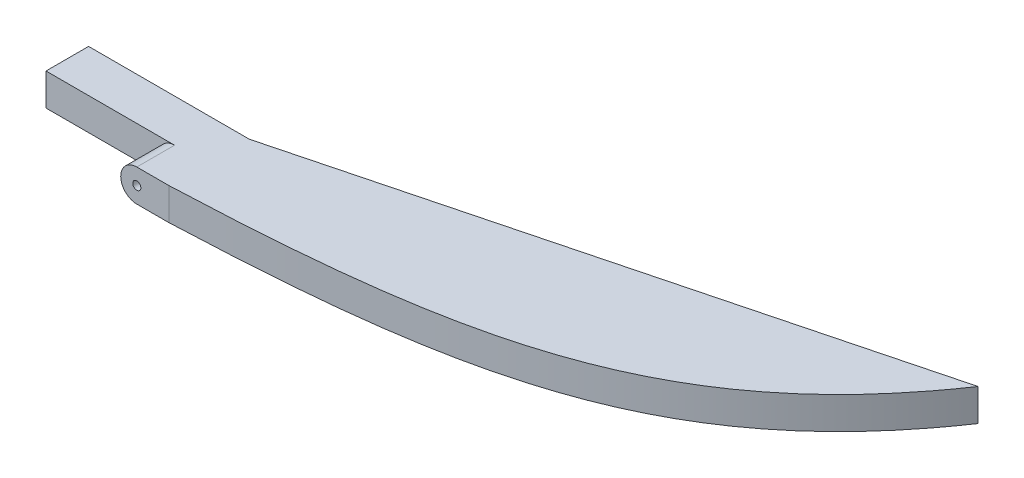
ISO-10303-21;
HEADER;
FILE_DESCRIPTION(('STEP AP214'),'2;1');
FILE_NAME('part.step','',(''),(''),'','','');
FILE_SCHEMA(('AUTOMOTIVE_DESIGN { 1 0 10303 214 1 1 1 1 }'));
ENDSEC;
DATA;
#1=APPLICATION_CONTEXT('core data for automotive mechanical design processes');
#2=APPLICATION_PROTOCOL_DEFINITION('international standard','automotive_design',2000,#1);
#3=PRODUCT_CONTEXT('',#1,'mechanical');
#4=PRODUCT('Part','Part','',(#3));
#5=PRODUCT_RELATED_PRODUCT_CATEGORY('part','',(#4));
#6=PRODUCT_DEFINITION_FORMATION('','',#4);
#7=PRODUCT_DEFINITION_CONTEXT('part definition',#1,'design');
#8=PRODUCT_DEFINITION('design','',#6,#7);
#9=PRODUCT_DEFINITION_SHAPE('','',#8);
#10=(LENGTH_UNIT() NAMED_UNIT(*) SI_UNIT(.MILLI.,.METRE.));
#11=(NAMED_UNIT(*) PLANE_ANGLE_UNIT() SI_UNIT($,.RADIAN.));
#12=(NAMED_UNIT(*) SI_UNIT($,.STERADIAN.) SOLID_ANGLE_UNIT());
#13=UNCERTAINTY_MEASURE_WITH_UNIT(LENGTH_MEASURE(1.E-05),#10,'distance_accuracy_value','');
#14=(GEOMETRIC_REPRESENTATION_CONTEXT(3) GLOBAL_UNCERTAINTY_ASSIGNED_CONTEXT((#13)) GLOBAL_UNIT_ASSIGNED_CONTEXT((#10,
#11,#12)) REPRESENTATION_CONTEXT('',''));
#15=CARTESIAN_POINT('',(0.,0.,0.));
#16=DIRECTION('',(0.,0.,1.));
#17=DIRECTION('',(1.,0.,0.));
#18=AXIS2_PLACEMENT_3D('',#15,#16,#17);
#19=CARTESIAN_POINT('',(0.,5.,0.));
#20=DIRECTION('',(0.,1.,0.));
#21=DIRECTION('',(0.,0.,1.));
#22=AXIS2_PLACEMENT_3D('',#19,#20,#21);
#23=PLANE('',#22);
#24=DIRECTION('',(-1.,0.,0.));
#25=VECTOR('',#24,1.);
#26=CARTESIAN_POINT('',(0.,5.,-5.875));
#27=LINE('',#26,#25);
#28=CARTESIAN_POINT('',(-5.,5.,-5.875));
#29=VERTEX_POINT('',#28);
#30=CARTESIAN_POINT('',(-25.,5.,-5.875));
#31=VERTEX_POINT('',#30);
#32=EDGE_CURVE('E51',#29,#31,#27,.T.);
#33=ORIENTED_EDGE('',*,*,#32,.F.);
#34=DIRECTION('',(0.,0.,1.));
#35=VECTOR('',#34,1.);
#36=CARTESIAN_POINT('',(-5.,5.,-5.875));
#37=LINE('',#36,#35);
#38=CARTESIAN_POINT('',(-5.,5.,0.));
#39=VERTEX_POINT('',#38);
#40=EDGE_CURVE('E102',#29,#39,#37,.T.);
#41=ORIENTED_EDGE('',*,*,#40,.T.);
#42=DIRECTION('',(1.,0.,0.));
#43=VECTOR('',#42,1.);
#44=CARTESIAN_POINT('',(-25.,5.,0.));
#45=LINE('',#44,#43);
#46=CARTESIAN_POINT('',(0.,5.,0.));
#47=VERTEX_POINT('',#46);
#48=EDGE_CURVE('E78',#39,#47,#45,.T.);
#49=ORIENTED_EDGE('',*,*,#48,.T.);
#50=CARTESIAN_POINT('',(9.68527644259352E-13,5.,0.));
#51=CARTESIAN_POINT('',(0.394136998698571,5.,-0.015797335774826));
#52=CARTESIAN_POINT('',(1.19495296634827,5.,-0.0488340451744374));
#53=CARTESIAN_POINT('',(2.9924488275803,5.,-0.125211317092621));
#54=CARTESIAN_POINT('',(4.57985606761734,5.,-0.200911655771645));
#55=CARTESIAN_POINT('',(6.61263735099886,5.,-0.301249970646708));
#56=CARTESIAN_POINT('',(8.39225173579563,5.,-0.398752477462649));
#57=CARTESIAN_POINT('',(10.3158780325456,5.,-0.509903004854173));
#58=CARTESIAN_POINT('',(12.1590488581689,5.,-0.626310038297874));
#59=CARTESIAN_POINT('',(14.5117367043059,5.,-0.785189542426716));
#60=CARTESIAN_POINT('',(17.3057175474928,5.,-0.994336582241799));
#61=CARTESIAN_POINT('',(20.1143980422333,5.,-1.2314721996505));
#62=CARTESIAN_POINT('',(22.9099051374178,5.,-1.4997766672866));
#63=CARTESIAN_POINT('',(25.7075404935678,5.,-1.79649348896231));
#64=CARTESIAN_POINT('',(29.4305210039473,5.,-2.23238068411249));
#65=CARTESIAN_POINT('',(34.4573189552186,5.,-2.92851632053862));
#66=CARTESIAN_POINT('',(39.917638308554,5.,-3.88805089955126));
#67=CARTESIAN_POINT('',(45.3269668853896,5.,-5.10508491568666));
#68=CARTESIAN_POINT('',(49.7699184930585,5.,-6.31907944343257));
#69=CARTESIAN_POINT('',(53.3461591554728,5.,-7.4480062039785));
#70=CARTESIAN_POINT('',(56.8702317662926,5.,-8.73099545644263));
#71=CARTESIAN_POINT('',(60.3296228282931,5.,-10.1800985563369));
#72=CARTESIAN_POINT('',(63.7102648370363,5.,-11.8049105173792));
#73=CARTESIAN_POINT('',(66.9975975917679,5.,-13.6114918141178));
#74=CARTESIAN_POINT('',(70.1773258697249,5.,-15.6015799192183));
#75=CARTESIAN_POINT('',(72.8542835868794,5.,-17.5008937092538));
#76=CARTESIAN_POINT('',(75.0672040776872,5.,-19.2370891591246));
#77=CARTESIAN_POINT('',(76.8547325054621,5.,-20.7525851322669));
#78=CARTESIAN_POINT('',(78.2501685733854,5.,-22.0046292242676));
#79=CARTESIAN_POINT('',(79.6197079738718,5.,-23.3032497684926));
#80=CARTESIAN_POINT('',(80.9623555969946,5.,-24.6474536181214));
#81=CARTESIAN_POINT('',(82.2773215060258,5.,-26.0360871147108));
#82=CARTESIAN_POINT('',(83.4031789305879,5.,-27.2888943209911));
#83=CARTESIAN_POINT('',(84.3453875712456,5.,-28.382707101818));
#84=CARTESIAN_POINT('',(85.1155330620901,5.,-29.3069028674258));
#85=CARTESIAN_POINT('',(85.7227153684007,5.,-30.0536236554861));
#86=CARTESIAN_POINT('',(86.3210254583511,5.,-30.8074219851701));
#87=CARTESIAN_POINT('',(86.9107122239662,5.,-31.5682804699309));
#88=CARTESIAN_POINT('',(87.4912553251952,5.,-32.3350400247342));
#89=CARTESIAN_POINT('',(88.0643121302846,5.,-33.1097551608932));
#90=CARTESIAN_POINT('',(88.6299361172786,5.,-33.8921081488089));
#91=CARTESIAN_POINT('',(89.0999032332647,5.,-34.5557401932857));
#92=CARTESIAN_POINT('',(89.5569559699906,5.,-35.2158292815368));
#93=CARTESIAN_POINT('',(89.8292929766433,5.,-35.6139091746178));
#94=CARTESIAN_POINT('',(89.9432469744588,5.,-35.7815692341193));
#95=CARTESIAN_POINT('',(90.0000000000007,5.,-35.8654273181337));
#96=B_SPLINE_CURVE_WITH_KNOTS('',4,(#50,#51,#52,#53,#54,#55,#56,#57,#58,#59,#60,#61,#62,#63,#64,
#65,#66,#67,#68,#69,#70,#71,#72,#73,#74,#75,#76,#77,#78,#79,#80,#81,#82,#83,#84,#85,#86,#87,#88,
#89,#90,#91,#92,#93,#94,#95),.UNSPECIFIED.,.F.,.F.,(5,1,1,1,1,1,1,1,1,1,1,1,1,1,1,1,1,1,1,1,1,1,
1,1,1,1,1,1,1,1,1,1,1,1,1,1,1,1,1,1,1,1,5),(0.0748229744830367,0.0903984077790677,
0.105973841075099,0.12154927437113,0.137124707667161,0.152700140929901,0.168275574192641,
0.183851007455381,0.199426440718121,0.230577306683844,0.261728172649567,0.277303606110959,
0.292879039572351,0.324029906495135,0.386331636273386,0.445924571490646,0.477075434078487,
0.50822630605085,0.539377158963895,0.570528010178799,0.601678867891275,0.632829681125078,
0.663980451014261,0.695131351715917,0.726282194003899,0.741857688091504,0.757433182179109,
0.773008671366096,0.788584160553083,0.804576905961795,0.820569651370507,0.836562506445381,
0.844558933982818,0.852555361520255,0.860551890959728,0.868548420399201,0.876544949838674,
0.884541479278147,0.892538010330116,0.900534541382085,0.908531072434054,0.912529337960039,
0.916527603486023),.UNSPECIFIED.);
#97=CARTESIAN_POINT('',(90.,5.,-35.8654273181327));
#98=VERTEX_POINT('',#97);
#99=EDGE_CURVE('E146',#47,#98,#96,.T.);
#100=ORIENTED_EDGE('',*,*,#99,.T.);
#101=DIRECTION('',(0.967912994794426,0.,-0.251285563668281));
#102=VECTOR('',#101,1.);
#103=CARTESIAN_POINT('',(-3.04028203098464,5.,-11.7106945686489));
#104=LINE('',#103,#102);
#105=CARTESIAN_POINT('',(0.,5.,-12.5));
#106=VERTEX_POINT('',#105);
#107=EDGE_CURVE('E151',#106,#98,#104,.T.);
#108=ORIENTED_EDGE('',*,*,#107,.F.);
#109=DIRECTION('',(1.,0.,0.));
#110=VECTOR('',#109,1.);
#111=CARTESIAN_POINT('',(-25.,5.,-12.5));
#112=LINE('',#111,#110);
#113=CARTESIAN_POINT('',(-25.,5.,-12.5));
#114=VERTEX_POINT('',#113);
#115=EDGE_CURVE('E142',#114,#106,#112,.T.);
#116=ORIENTED_EDGE('',*,*,#115,.F.);
#117=DIRECTION('',(0.,0.,-1.));
#118=VECTOR('',#117,1.);
#119=CARTESIAN_POINT('',(-25.,5.,-12.5));
#120=LINE('',#119,#118);
#121=EDGE_CURVE('E117',#31,#114,#120,.T.);
#122=ORIENTED_EDGE('',*,*,#121,.F.);
#123=EDGE_LOOP('',(#33,#41,#49,#100,#108,#116,#122));
#124=FACE_BOUND('',#123,.T.);
#125=ADVANCED_FACE('F35',(#124),#23,.T.);
#126=CARTESIAN_POINT('',(0.,0.,0.));
#127=DIRECTION('',(0.,1.,0.));
#128=DIRECTION('',(0.,0.,1.));
#129=AXIS2_PLACEMENT_3D('',#126,#127,#128);
#130=PLANE('',#129);
#131=DIRECTION('',(0.,0.,1.));
#132=VECTOR('',#131,1.);
#133=CARTESIAN_POINT('',(-5.,0.,-5.875));
#134=LINE('',#133,#132);
#135=CARTESIAN_POINT('',(-5.,0.,-5.875));
#136=VERTEX_POINT('',#135);
#137=CARTESIAN_POINT('',(-5.,0.,0.));
#138=VERTEX_POINT('',#137);
#139=EDGE_CURVE('E108',#136,#138,#134,.T.);
#140=ORIENTED_EDGE('',*,*,#139,.F.);
#141=DIRECTION('',(1.,0.,0.));
#142=VECTOR('',#141,1.);
#143=CARTESIAN_POINT('',(0.,0.,-5.875));
#144=LINE('',#143,#142);
#145=CARTESIAN_POINT('',(-25.,0.,-5.875));
#146=VERTEX_POINT('',#145);
#147=EDGE_CURVE('E109',#146,#136,#144,.T.);
#148=ORIENTED_EDGE('',*,*,#147,.F.);
#149=DIRECTION('',(0.,0.,1.));
#150=VECTOR('',#149,1.);
#151=CARTESIAN_POINT('',(-25.,0.,-12.5));
#152=LINE('',#151,#150);
#153=CARTESIAN_POINT('',(-25.,0.,-12.5));
#154=VERTEX_POINT('',#153);
#155=EDGE_CURVE('E134',#154,#146,#152,.T.);
#156=ORIENTED_EDGE('',*,*,#155,.F.);
#157=DIRECTION('',(1.,0.,0.));
#158=VECTOR('',#157,1.);
#159=CARTESIAN_POINT('',(-25.,0.,-12.5));
#160=LINE('',#159,#158);
#161=CARTESIAN_POINT('',(0.,0.,-12.5));
#162=VERTEX_POINT('',#161);
#163=EDGE_CURVE('E139',#154,#162,#160,.T.);
#164=ORIENTED_EDGE('',*,*,#163,.T.);
#165=DIRECTION('',(0.967912994794426,0.,-0.251285563668281));
#166=VECTOR('',#165,1.);
#167=CARTESIAN_POINT('',(-3.04028203098464,0.,-11.7106945686489));
#168=LINE('',#167,#166);
#169=CARTESIAN_POINT('',(90.,0.,-35.8654273181327));
#170=VERTEX_POINT('',#169);
#171=EDGE_CURVE('E152',#162,#170,#168,.T.);
#172=ORIENTED_EDGE('',*,*,#171,.T.);
#173=CARTESIAN_POINT('',(9.68527644259352E-13,0.,0.));
#174=CARTESIAN_POINT('',(0.394136998698571,0.,-0.015797335774826));
#175=CARTESIAN_POINT('',(1.19495296634827,0.,-0.0488340451744374));
#176=CARTESIAN_POINT('',(2.9924488275803,0.,-0.125211317092621));
#177=CARTESIAN_POINT('',(4.57985606761734,0.,-0.200911655771645));
#178=CARTESIAN_POINT('',(6.61263735099886,0.,-0.301249970646708));
#179=CARTESIAN_POINT('',(8.39225173579563,0.,-0.398752477462649));
#180=CARTESIAN_POINT('',(10.3158780325456,0.,-0.509903004854173));
#181=CARTESIAN_POINT('',(12.1590488581689,0.,-0.626310038297874));
#182=CARTESIAN_POINT('',(14.5117367043059,0.,-0.785189542426716));
#183=CARTESIAN_POINT('',(17.3057175474928,0.,-0.994336582241799));
#184=CARTESIAN_POINT('',(20.1143980422333,0.,-1.2314721996505));
#185=CARTESIAN_POINT('',(22.9099051374178,0.,-1.4997766672866));
#186=CARTESIAN_POINT('',(25.7075404935678,0.,-1.79649348896231));
#187=CARTESIAN_POINT('',(29.4305210039473,0.,-2.23238068411249));
#188=CARTESIAN_POINT('',(34.4573189552186,0.,-2.92851632053862));
#189=CARTESIAN_POINT('',(39.917638308554,0.,-3.88805089955126));
#190=CARTESIAN_POINT('',(45.3269668853896,0.,-5.10508491568666));
#191=CARTESIAN_POINT('',(49.7699184930585,0.,-6.31907944343257));
#192=CARTESIAN_POINT('',(53.3461591554728,0.,-7.4480062039785));
#193=CARTESIAN_POINT('',(56.8702317662926,0.,-8.73099545644263));
#194=CARTESIAN_POINT('',(60.3296228282931,0.,-10.1800985563369));
#195=CARTESIAN_POINT('',(63.7102648370363,0.,-11.8049105173792));
#196=CARTESIAN_POINT('',(66.9975975917679,0.,-13.6114918141178));
#197=CARTESIAN_POINT('',(70.1773258697249,0.,-15.6015799192183));
#198=CARTESIAN_POINT('',(72.8542835868794,0.,-17.5008937092538));
#199=CARTESIAN_POINT('',(75.0672040776872,0.,-19.2370891591246));
#200=CARTESIAN_POINT('',(76.8547325054621,0.,-20.7525851322669));
#201=CARTESIAN_POINT('',(78.2501685733854,0.,-22.0046292242676));
#202=CARTESIAN_POINT('',(79.6197079738718,0.,-23.3032497684926));
#203=CARTESIAN_POINT('',(80.9623555969946,0.,-24.6474536181214));
#204=CARTESIAN_POINT('',(82.2773215060258,0.,-26.0360871147108));
#205=CARTESIAN_POINT('',(83.4031789305879,0.,-27.2888943209911));
#206=CARTESIAN_POINT('',(84.3453875712456,0.,-28.382707101818));
#207=CARTESIAN_POINT('',(85.1155330620901,0.,-29.3069028674258));
#208=CARTESIAN_POINT('',(85.7227153684007,0.,-30.0536236554861));
#209=CARTESIAN_POINT('',(86.3210254583511,0.,-30.8074219851701));
#210=CARTESIAN_POINT('',(86.9107122239662,0.,-31.5682804699309));
#211=CARTESIAN_POINT('',(87.4912553251952,0.,-32.3350400247342));
#212=CARTESIAN_POINT('',(88.0643121302846,0.,-33.1097551608932));
#213=CARTESIAN_POINT('',(88.6299361172786,0.,-33.8921081488089));
#214=CARTESIAN_POINT('',(89.0999032332647,0.,-34.5557401932857));
#215=CARTESIAN_POINT('',(89.5569559699906,0.,-35.2158292815368));
#216=CARTESIAN_POINT('',(89.8292929766433,0.,-35.6139091746178));
#217=CARTESIAN_POINT('',(89.9432469744588,0.,-35.7815692341193));
#218=CARTESIAN_POINT('',(90.0000000000007,0.,-35.8654273181337));
#219=B_SPLINE_CURVE_WITH_KNOTS('',4,(#173,#174,#175,#176,#177,#178,#179,#180,#181,#182,#183,
#184,#185,#186,#187,#188,#189,#190,#191,#192,#193,#194,#195,#196,#197,#198,#199,#200,#201,#202,
#203,#204,#205,#206,#207,#208,#209,#210,#211,#212,#213,#214,#215,#216,#217,#218),.UNSPECIFIED.,
.F.,.F.,(5,1,1,1,1,1,1,1,1,1,1,1,1,1,1,1,1,1,1,1,1,1,1,1,1,1,1,1,1,1,1,1,1,1,1,1,1,1,1,1,1,1,5),
(0.0748229744830367,0.0903984077790677,0.105973841075099,0.12154927437113,0.137124707667161,
0.152700140929901,0.168275574192641,0.183851007455381,0.199426440718121,0.230577306683844,
0.261728172649567,0.277303606110959,0.292879039572351,0.324029906495135,0.386331636273386,
0.445924571490646,0.477075434078487,0.50822630605085,0.539377158963895,0.570528010178799,
0.601678867891275,0.632829681125078,0.663980451014261,0.695131351715917,0.726282194003899,
0.741857688091504,0.757433182179109,0.773008671366096,0.788584160553083,0.804576905961795,
0.820569651370507,0.836562506445381,0.844558933982818,0.852555361520255,0.860551890959728,
0.868548420399201,0.876544949838674,0.884541479278147,0.892538010330116,0.900534541382085,
0.908531072434054,0.912529337960039,0.916527603486023),.UNSPECIFIED.);
#220=CARTESIAN_POINT('',(0.,0.,0.));
#221=VERTEX_POINT('',#220);
#222=EDGE_CURVE('E145',#221,#170,#219,.T.);
#223=ORIENTED_EDGE('',*,*,#222,.F.);
#224=DIRECTION('',(1.,0.,0.));
#225=VECTOR('',#224,1.);
#226=CARTESIAN_POINT('',(-25.,0.,0.));
#227=LINE('',#226,#225);
#228=EDGE_CURVE('E137',#138,#221,#227,.T.);
#229=ORIENTED_EDGE('',*,*,#228,.F.);
#230=EDGE_LOOP('',(#140,#148,#156,#164,#172,#223,#229));
#231=FACE_BOUND('',#230,.T.);
#232=ADVANCED_FACE('F171',(#231),#130,.F.);
#233=CARTESIAN_POINT('',(-25.,0.,0.));
#234=DIRECTION('',(0.,0.,-1.));
#235=DIRECTION('',(0.,1.,0.));
#236=AXIS2_PLACEMENT_3D('',#233,#234,#235);
#237=PLANE('',#236);
#238=CARTESIAN_POINT('',(-5.,2.50000000000001,0.));
#239=DIRECTION('',(0.,0.,1.));
#240=DIRECTION('',(1.,0.,0.));
#241=AXIS2_PLACEMENT_3D('',#238,#239,#240);
#242=CIRCLE('',#241,0.629999999999997);
#243=CARTESIAN_POINT('',(-4.37,2.50000000000001,0.));
#244=VERTEX_POINT('',#243);
#245=EDGE_CURVE('E124',#244,#244,#242,.T.);
#246=ORIENTED_EDGE('',*,*,#245,.F.);
#247=EDGE_LOOP('',(#246));
#248=FACE_BOUND('',#247,.T.);
#249=CARTESIAN_POINT('',(-5.,2.50000000000001,0.));
#250=DIRECTION('',(0.,0.,1.));
#251=DIRECTION('',(1.,0.,0.));
#252=AXIS2_PLACEMENT_3D('',#249,#250,#251);
#253=CIRCLE('',#252,2.49999999999999);
#254=EDGE_CURVE('E107',#39,#138,#253,.T.);
#255=ORIENTED_EDGE('',*,*,#254,.T.);
#256=ORIENTED_EDGE('',*,*,#228,.T.);
#257=DIRECTION('',(0.,-1.,0.));
#258=VECTOR('',#257,1.);
#259=CARTESIAN_POINT('',(0.,5.,0.));
#260=LINE('',#259,#258);
#261=EDGE_CURVE('E11',#47,#221,#260,.T.);
#262=ORIENTED_EDGE('',*,*,#261,.F.);
#263=ORIENTED_EDGE('',*,*,#48,.F.);
#264=EDGE_LOOP('',(#255,#256,#262,#263));
#265=FACE_BOUND('',#264,.T.);
#266=ADVANCED_FACE('F190',(#248,#265),#237,.F.);
#267=CARTESIAN_POINT('',(-25.,0.,0.));
#268=DIRECTION('',(1.,0.,0.));
#269=DIRECTION('',(0.,0.,-1.));
#270=AXIS2_PLACEMENT_3D('',#267,#268,#269);
#271=PLANE('',#270);
#272=DIRECTION('',(0.,-1.,0.));
#273=VECTOR('',#272,1.);
#274=CARTESIAN_POINT('',(-25.,0.,-5.875));
#275=LINE('',#274,#273);
#276=EDGE_CURVE('E118',#31,#146,#275,.T.);
#277=ORIENTED_EDGE('',*,*,#276,.F.);
#278=ORIENTED_EDGE('',*,*,#121,.T.);
#279=DIRECTION('',(0.,-1.,0.));
#280=VECTOR('',#279,1.);
#281=CARTESIAN_POINT('',(-25.,0.,-12.5));
#282=LINE('',#281,#280);
#283=EDGE_CURVE('E132',#114,#154,#282,.T.);
#284=ORIENTED_EDGE('',*,*,#283,.T.);
#285=ORIENTED_EDGE('',*,*,#155,.T.);
#286=EDGE_LOOP('',(#277,#278,#284,#285));
#287=FACE_BOUND('',#286,.T.);
#288=ADVANCED_FACE('F174',(#287),#271,.F.);
#289=DIRECTION('',(0.,-1.,0.));
#290=VECTOR('',#289,1.);
#291=SURFACE_OF_LINEAR_EXTRUSION('',#96,#290);
#292=ORIENTED_EDGE('',*,*,#222,.T.);
#293=DIRECTION('',(0.,-1.,0.));
#294=VECTOR('',#293,1.);
#295=CARTESIAN_POINT('',(90.,5.,-35.8654273181327));
#296=LINE('',#295,#294);
#297=EDGE_CURVE('E44',#98,#170,#296,.T.);
#298=ORIENTED_EDGE('',*,*,#297,.F.);
#299=ORIENTED_EDGE('',*,*,#99,.F.);
#300=ORIENTED_EDGE('',*,*,#261,.T.);
#301=EDGE_LOOP('',(#292,#298,#299,#300));
#302=FACE_BOUND('',#301,.T.);
#303=ADVANCED_FACE('F37',(#302),#291,.F.);
#304=CARTESIAN_POINT('',(-3.04028203098464,5.,-11.7106945686489));
#305=DIRECTION('',(-0.251285563668281,0.,-0.967912994794426));
#306=DIRECTION('',(-0.967912994794426,0.,0.251285563668281));
#307=AXIS2_PLACEMENT_3D('',#304,#305,#306);
#308=PLANE('',#307);
#309=ORIENTED_EDGE('',*,*,#171,.F.);
#310=DIRECTION('',(0.,-1.,0.));
#311=VECTOR('',#310,1.);
#312=CARTESIAN_POINT('',(0.,5.,-12.5));
#313=LINE('',#312,#311);
#314=EDGE_CURVE('E60',#106,#162,#313,.T.);
#315=ORIENTED_EDGE('',*,*,#314,.F.);
#316=ORIENTED_EDGE('',*,*,#107,.T.);
#317=ORIENTED_EDGE('',*,*,#297,.T.);
#318=EDGE_LOOP('',(#309,#315,#316,#317));
#319=FACE_BOUND('',#318,.T.);
#320=ADVANCED_FACE('F175',(#319),#308,.T.);
#321=CARTESIAN_POINT('',(-25.,0.,-12.5));
#322=DIRECTION('',(0.,0.,1.));
#323=DIRECTION('',(1.,0.,0.));
#324=AXIS2_PLACEMENT_3D('',#321,#322,#323);
#325=PLANE('',#324);
#326=ORIENTED_EDGE('',*,*,#314,.T.);
#327=ORIENTED_EDGE('',*,*,#163,.F.);
#328=ORIENTED_EDGE('',*,*,#283,.F.);
#329=ORIENTED_EDGE('',*,*,#115,.T.);
#330=EDGE_LOOP('',(#326,#327,#328,#329));
#331=FACE_BOUND('',#330,.T.);
#332=ADVANCED_FACE('F167',(#331),#325,.F.);
#333=CARTESIAN_POINT('',(-5.,2.50000000000001,-1.5));
#334=DIRECTION('',(0.,0.,1.));
#335=DIRECTION('',(1.,0.,0.));
#336=AXIS2_PLACEMENT_3D('',#333,#334,#335);
#337=CYLINDRICAL_SURFACE('',#336,0.629999999999997);
#338=CARTESIAN_POINT('',(-5.,2.50000000000001,-1.5));
#339=DIRECTION('',(0.,0.,1.));
#340=DIRECTION('',(1.,0.,0.));
#341=AXIS2_PLACEMENT_3D('',#338,#339,#340);
#342=CIRCLE('',#341,0.629999999999997);
#343=CARTESIAN_POINT('',(-4.37,2.50000000000001,-1.5));
#344=VERTEX_POINT('',#343);
#345=EDGE_CURVE('E126',#344,#344,#342,.T.);
#346=ORIENTED_EDGE('',*,*,#345,.F.);
#347=EDGE_LOOP('',(#346));
#348=FACE_BOUND('',#347,.T.);
#349=ORIENTED_EDGE('',*,*,#245,.T.);
#350=EDGE_LOOP('',(#349));
#351=FACE_BOUND('',#350,.T.);
#352=ADVANCED_FACE('F181',(#348,#351),#337,.F.);
#353=CARTESIAN_POINT('',(-5.,2.50000000000001,-1.5));
#354=DIRECTION('',(0.,0.,1.));
#355=DIRECTION('',(1.,0.,0.));
#356=AXIS2_PLACEMENT_3D('',#353,#354,#355);
#357=PLANE('',#356);
#358=ORIENTED_EDGE('',*,*,#345,.T.);
#359=EDGE_LOOP('',(#358));
#360=FACE_BOUND('',#359,.T.);
#361=ADVANCED_FACE('F199',(#360),#357,.T.);
#362=CARTESIAN_POINT('',(-5.,2.50000000000001,-5.875));
#363=DIRECTION('',(0.,0.,1.));
#364=DIRECTION('',(1.,0.,0.));
#365=AXIS2_PLACEMENT_3D('',#362,#363,#364);
#366=CYLINDRICAL_SURFACE('',#365,2.49999999999999);
#367=ORIENTED_EDGE('',*,*,#254,.F.);
#368=ORIENTED_EDGE('',*,*,#40,.F.);
#369=CARTESIAN_POINT('',(-5.,2.50000000000001,-5.875));
#370=DIRECTION('',(0.,0.,1.));
#371=DIRECTION('',(1.,0.,0.));
#372=AXIS2_PLACEMENT_3D('',#369,#370,#371);
#373=CIRCLE('',#372,2.49999999999999);
#374=EDGE_CURVE('E104',#29,#136,#373,.T.);
#375=ORIENTED_EDGE('',*,*,#374,.T.);
#376=ORIENTED_EDGE('',*,*,#139,.T.);
#377=EDGE_LOOP('',(#367,#368,#375,#376));
#378=FACE_BOUND('',#377,.T.);
#379=ADVANCED_FACE('F103',(#378),#366,.T.);
#380=CARTESIAN_POINT('',(0.,0.,-5.875));
#381=DIRECTION('',(0.,0.,1.));
#382=DIRECTION('',(1.,0.,0.));
#383=AXIS2_PLACEMENT_3D('',#380,#381,#382);
#384=PLANE('',#383);
#385=ORIENTED_EDGE('',*,*,#374,.F.);
#386=ORIENTED_EDGE('',*,*,#32,.T.);
#387=ORIENTED_EDGE('',*,*,#276,.T.);
#388=ORIENTED_EDGE('',*,*,#147,.T.);
#389=EDGE_LOOP('',(#385,#386,#387,#388));
#390=FACE_BOUND('',#389,.T.);
#391=ADVANCED_FACE('F111',(#390),#384,.T.);
#392=CLOSED_SHELL('',(#125,#232,#266,#288,#303,#320,#332,#352,#361,#379,#391));
#393=MANIFOLD_SOLID_BREP('B2',#392);
#394=ADVANCED_BREP_SHAPE_REPRESENTATION('',(#18,#393),#14);
#395=SHAPE_DEFINITION_REPRESENTATION(#9,#394);
ENDSEC;
END-ISO-10303-21;
